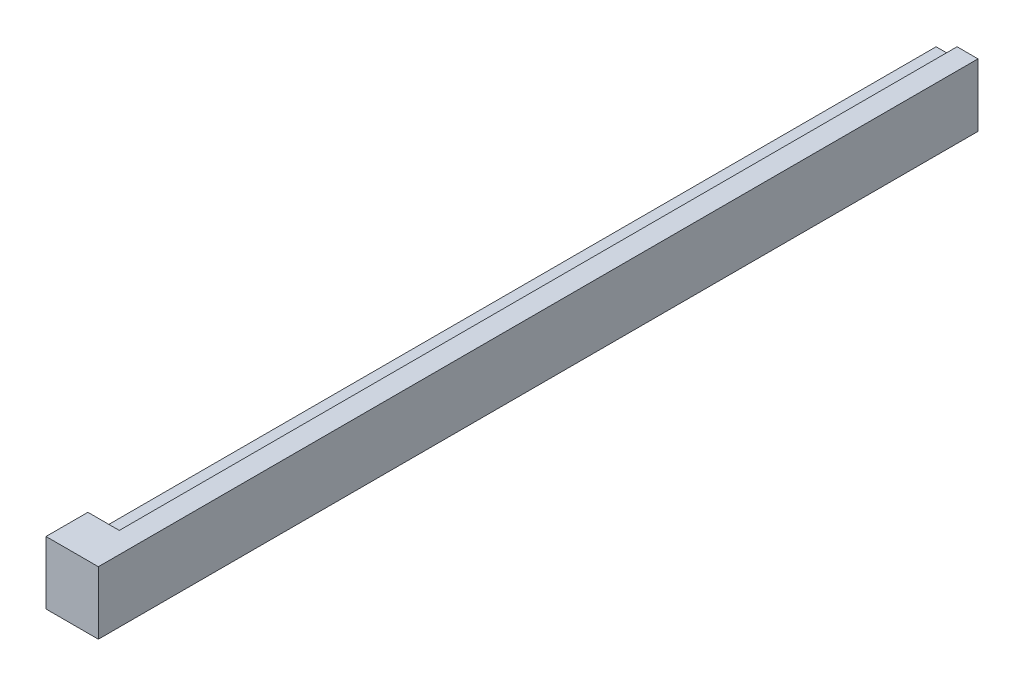
ISO-10303-21;
HEADER;
FILE_DESCRIPTION(('STEP AP214'),'2;1');
FILE_NAME('part.step','',(''),(''),'','','');
FILE_SCHEMA(('AUTOMOTIVE_DESIGN { 1 0 10303 214 1 1 1 1 }'));
ENDSEC;
DATA;
#1=APPLICATION_CONTEXT('core data for automotive mechanical design processes');
#2=APPLICATION_PROTOCOL_DEFINITION('international standard','automotive_design',2000,#1);
#3=PRODUCT_CONTEXT('',#1,'mechanical');
#4=PRODUCT('Part','Part','',(#3));
#5=PRODUCT_RELATED_PRODUCT_CATEGORY('part','',(#4));
#6=PRODUCT_DEFINITION_FORMATION('','',#4);
#7=PRODUCT_DEFINITION_CONTEXT('part definition',#1,'design');
#8=PRODUCT_DEFINITION('design','',#6,#7);
#9=PRODUCT_DEFINITION_SHAPE('','',#8);
#10=(LENGTH_UNIT() NAMED_UNIT(*) SI_UNIT(.MILLI.,.METRE.));
#11=(NAMED_UNIT(*) PLANE_ANGLE_UNIT() SI_UNIT($,.RADIAN.));
#12=(NAMED_UNIT(*) SI_UNIT($,.STERADIAN.) SOLID_ANGLE_UNIT());
#13=UNCERTAINTY_MEASURE_WITH_UNIT(LENGTH_MEASURE(1.E-05),#10,'distance_accuracy_value','');
#14=(GEOMETRIC_REPRESENTATION_CONTEXT(3) GLOBAL_UNCERTAINTY_ASSIGNED_CONTEXT((#13)) GLOBAL_UNIT_ASSIGNED_CONTEXT((#10,
#11,#12)) REPRESENTATION_CONTEXT('',''));
#15=CARTESIAN_POINT('',(0.,0.,0.));
#16=DIRECTION('',(0.,0.,1.));
#17=DIRECTION('',(1.,0.,0.));
#18=AXIS2_PLACEMENT_3D('',#15,#16,#17);
#19=CARTESIAN_POINT('',(25.,-25.,1000.));
#20=DIRECTION('',(0.,1.,0.));
#21=DIRECTION('',(0.,0.,1.));
#22=AXIS2_PLACEMENT_3D('',#19,#20,#21);
#23=PLANE('',#22);
#24=DIRECTION('',(1.,0.,0.));
#25=VECTOR('',#24,1.);
#26=CARTESIAN_POINT('',(25.,-25.,-1000.));
#27=LINE('',#26,#25);
#28=CARTESIAN_POINT('',(0.,-25.,-1000.));
#29=VERTEX_POINT('',#28);
#30=CARTESIAN_POINT('',(25.,-25.,-1000.));
#31=VERTEX_POINT('',#30);
#32=EDGE_CURVE('E189',#29,#31,#27,.T.);
#33=ORIENTED_EDGE('',*,*,#32,.T.);
#34=DIRECTION('',(0.,0.,-1.));
#35=VECTOR('',#34,1.);
#36=CARTESIAN_POINT('',(25.,-25.,1000.));
#37=LINE('',#36,#35);
#38=CARTESIAN_POINT('',(25.,-25.,1000.));
#39=VERTEX_POINT('',#38);
#40=EDGE_CURVE('E46',#39,#31,#37,.T.);
#41=ORIENTED_EDGE('',*,*,#40,.F.);
#42=DIRECTION('',(1.,0.,0.));
#43=VECTOR('',#42,1.);
#44=CARTESIAN_POINT('',(25.,-25.,1000.));
#45=LINE('',#44,#43);
#46=CARTESIAN_POINT('',(0.,-25.,1000.));
#47=VERTEX_POINT('',#46);
#48=EDGE_CURVE('E120',#47,#39,#45,.T.);
#49=ORIENTED_EDGE('',*,*,#48,.F.);
#50=DIRECTION('',(0.,0.,-1.));
#51=VECTOR('',#50,1.);
#52=CARTESIAN_POINT('',(0.,-25.,1000.));
#53=LINE('',#52,#51);
#54=EDGE_CURVE('E11',#47,#29,#53,.T.);
#55=ORIENTED_EDGE('',*,*,#54,.T.);
#56=EDGE_LOOP('',(#33,#41,#49,#55));
#57=FACE_BOUND('',#56,.T.);
#58=ADVANCED_FACE('F38',(#57),#23,.F.);
#59=CARTESIAN_POINT('',(25.,-50.,1000.));
#60=DIRECTION('',(1.,0.,0.));
#61=DIRECTION('',(0.,0.,-1.));
#62=AXIS2_PLACEMENT_3D('',#59,#60,#61);
#63=PLANE('',#62);
#64=DIRECTION('',(0.,-1.,0.));
#65=VECTOR('',#64,1.);
#66=CARTESIAN_POINT('',(25.,-50.,-1000.));
#67=LINE('',#66,#65);
#68=CARTESIAN_POINT('',(25.,-50.,-1000.));
#69=VERTEX_POINT('',#68);
#70=EDGE_CURVE('E191',#31,#69,#67,.T.);
#71=ORIENTED_EDGE('',*,*,#70,.T.);
#72=DIRECTION('',(0.,0.,-1.));
#73=VECTOR('',#72,1.);
#74=CARTESIAN_POINT('',(25.,-50.,1000.));
#75=LINE('',#74,#73);
#76=CARTESIAN_POINT('',(25.,-50.,1000.));
#77=VERTEX_POINT('',#76);
#78=EDGE_CURVE('E247',#77,#69,#75,.T.);
#79=ORIENTED_EDGE('',*,*,#78,.F.);
#80=DIRECTION('',(0.,-1.,0.));
#81=VECTOR('',#80,1.);
#82=CARTESIAN_POINT('',(25.,-50.,1000.));
#83=LINE('',#82,#81);
#84=EDGE_CURVE('E255',#39,#77,#83,.T.);
#85=ORIENTED_EDGE('',*,*,#84,.F.);
#86=ORIENTED_EDGE('',*,*,#40,.T.);
#87=EDGE_LOOP('',(#71,#79,#85,#86));
#88=FACE_BOUND('',#87,.T.);
#89=ADVANCED_FACE('F253',(#88),#63,.F.);
#90=CARTESIAN_POINT('',(50.,-50.,1000.));
#91=DIRECTION('',(0.,1.,0.));
#92=DIRECTION('',(0.,0.,1.));
#93=AXIS2_PLACEMENT_3D('',#90,#91,#92);
#94=PLANE('',#93);
#95=DIRECTION('',(1.,0.,0.));
#96=VECTOR('',#95,1.);
#97=CARTESIAN_POINT('',(50.,-50.,-1000.));
#98=LINE('',#97,#96);
#99=CARTESIAN_POINT('',(50.,-50.,-1000.));
#100=VERTEX_POINT('',#99);
#101=EDGE_CURVE('E194',#69,#100,#98,.T.);
#102=ORIENTED_EDGE('',*,*,#101,.T.);
#103=DIRECTION('',(0.,0.,-1.));
#104=VECTOR('',#103,1.);
#105=CARTESIAN_POINT('',(50.,-50.,1000.));
#106=LINE('',#105,#104);
#107=CARTESIAN_POINT('',(50.,-50.,1000.));
#108=VERTEX_POINT('',#107);
#109=EDGE_CURVE('E244',#108,#100,#106,.T.);
#110=ORIENTED_EDGE('',*,*,#109,.F.);
#111=DIRECTION('',(1.,0.,0.));
#112=VECTOR('',#111,1.);
#113=CARTESIAN_POINT('',(50.,-50.,1000.));
#114=LINE('',#113,#112);
#115=EDGE_CURVE('E276',#77,#108,#114,.T.);
#116=ORIENTED_EDGE('',*,*,#115,.F.);
#117=ORIENTED_EDGE('',*,*,#78,.T.);
#118=EDGE_LOOP('',(#102,#110,#116,#117));
#119=FACE_BOUND('',#118,.T.);
#120=ADVANCED_FACE('F264',(#119),#94,.F.);
#121=CARTESIAN_POINT('',(50.,-25.,1000.));
#122=DIRECTION('',(-1.,0.,0.));
#123=DIRECTION('',(0.,0.,1.));
#124=AXIS2_PLACEMENT_3D('',#121,#122,#123);
#125=PLANE('',#124);
#126=DIRECTION('',(0.,1.,0.));
#127=VECTOR('',#126,1.);
#128=CARTESIAN_POINT('',(50.,-25.,-1000.));
#129=LINE('',#128,#127);
#130=CARTESIAN_POINT('',(50.,-25.,-1000.));
#131=VERTEX_POINT('',#130);
#132=EDGE_CURVE('E196',#100,#131,#129,.T.);
#133=ORIENTED_EDGE('',*,*,#132,.T.);
#134=DIRECTION('',(0.,0.,-1.));
#135=VECTOR('',#134,1.);
#136=CARTESIAN_POINT('',(50.,-25.,1000.));
#137=LINE('',#136,#135);
#138=CARTESIAN_POINT('',(50.,-25.,1000.));
#139=VERTEX_POINT('',#138);
#140=EDGE_CURVE('E241',#139,#131,#137,.T.);
#141=ORIENTED_EDGE('',*,*,#140,.F.);
#142=DIRECTION('',(0.,1.,0.));
#143=VECTOR('',#142,1.);
#144=CARTESIAN_POINT('',(50.,-25.,1000.));
#145=LINE('',#144,#143);
#146=EDGE_CURVE('E270',#108,#139,#145,.T.);
#147=ORIENTED_EDGE('',*,*,#146,.F.);
#148=ORIENTED_EDGE('',*,*,#109,.T.);
#149=EDGE_LOOP('',(#133,#141,#147,#148));
#150=FACE_BOUND('',#149,.T.);
#151=ADVANCED_FACE('F268',(#150),#125,.F.);
#152=CARTESIAN_POINT('',(75.,-25.,1000.));
#153=DIRECTION('',(0.,1.,0.));
#154=DIRECTION('',(-1.,0.,0.));
#155=AXIS2_PLACEMENT_3D('',#152,#153,#154);
#156=PLANE('',#155);
#157=DIRECTION('',(1.,0.,0.));
#158=VECTOR('',#157,1.);
#159=CARTESIAN_POINT('',(75.,-25.,-1000.));
#160=LINE('',#159,#158);
#161=CARTESIAN_POINT('',(75.,-25.,-1000.));
#162=VERTEX_POINT('',#161);
#163=EDGE_CURVE('E198',#131,#162,#160,.T.);
#164=ORIENTED_EDGE('',*,*,#163,.T.);
#165=DIRECTION('',(0.,0.,-1.));
#166=VECTOR('',#165,1.);
#167=CARTESIAN_POINT('',(75.,-25.,1000.));
#168=LINE('',#167,#166);
#169=CARTESIAN_POINT('',(75.,-25.,1000.));
#170=VERTEX_POINT('',#169);
#171=EDGE_CURVE('E238',#170,#162,#168,.T.);
#172=ORIENTED_EDGE('',*,*,#171,.F.);
#173=DIRECTION('',(1.,0.,0.));
#174=VECTOR('',#173,1.);
#175=CARTESIAN_POINT('',(75.,-25.,1000.));
#176=LINE('',#175,#174);
#177=EDGE_CURVE('E275',#139,#170,#176,.T.);
#178=ORIENTED_EDGE('',*,*,#177,.F.);
#179=ORIENTED_EDGE('',*,*,#140,.T.);
#180=EDGE_LOOP('',(#164,#172,#178,#179));
#181=FACE_BOUND('',#180,.T.);
#182=ADVANCED_FACE('F392',(#181),#156,.F.);
#183=CARTESIAN_POINT('',(75.,-75.,1000.));
#184=DIRECTION('',(1.,0.,0.));
#185=DIRECTION('',(0.,1.,0.));
#186=AXIS2_PLACEMENT_3D('',#183,#184,#185);
#187=PLANE('',#186);
#188=DIRECTION('',(0.,-1.,0.));
#189=VECTOR('',#188,1.);
#190=CARTESIAN_POINT('',(75.,-75.,-1000.));
#191=LINE('',#190,#189);
#192=CARTESIAN_POINT('',(75.,-75.,-1000.));
#193=VERTEX_POINT('',#192);
#194=EDGE_CURVE('E200',#162,#193,#191,.T.);
#195=ORIENTED_EDGE('',*,*,#194,.T.);
#196=DIRECTION('',(0.,0.,-1.));
#197=VECTOR('',#196,1.);
#198=CARTESIAN_POINT('',(75.,-75.,1000.));
#199=LINE('',#198,#197);
#200=CARTESIAN_POINT('',(75.,-75.,1000.));
#201=VERTEX_POINT('',#200);
#202=EDGE_CURVE('E235',#201,#193,#199,.T.);
#203=ORIENTED_EDGE('',*,*,#202,.F.);
#204=DIRECTION('',(0.,-1.,0.));
#205=VECTOR('',#204,1.);
#206=CARTESIAN_POINT('',(75.,-75.,1000.));
#207=LINE('',#206,#205);
#208=EDGE_CURVE('E285',#170,#201,#207,.T.);
#209=ORIENTED_EDGE('',*,*,#208,.F.);
#210=ORIENTED_EDGE('',*,*,#171,.T.);
#211=EDGE_LOOP('',(#195,#203,#209,#210));
#212=FACE_BOUND('',#211,.T.);
#213=ADVANCED_FACE('F395',(#212),#187,.F.);
#214=CARTESIAN_POINT('',(125.,-75.,1000.));
#215=DIRECTION('',(0.,1.,0.));
#216=DIRECTION('',(0.,0.,1.));
#217=AXIS2_PLACEMENT_3D('',#214,#215,#216);
#218=PLANE('',#217);
#219=DIRECTION('',(1.,0.,0.));
#220=VECTOR('',#219,1.);
#221=CARTESIAN_POINT('',(125.,-75.,-1000.));
#222=LINE('',#221,#220);
#223=CARTESIAN_POINT('',(125.,-75.,-1000.));
#224=VERTEX_POINT('',#223);
#225=EDGE_CURVE('E202',#193,#224,#222,.T.);
#226=ORIENTED_EDGE('',*,*,#225,.T.);
#227=DIRECTION('',(0.,0.,-1.));
#228=VECTOR('',#227,1.);
#229=CARTESIAN_POINT('',(125.,-75.,1000.));
#230=LINE('',#229,#228);
#231=CARTESIAN_POINT('',(125.,-75.,1100.));
#232=VERTEX_POINT('',#231);
#233=EDGE_CURVE('E232',#232,#224,#230,.T.);
#234=ORIENTED_EDGE('',*,*,#233,.F.);
#235=DIRECTION('',(1.,0.,0.));
#236=VECTOR('',#235,1.);
#237=CARTESIAN_POINT('',(0.,-75.,1100.));
#238=LINE('',#237,#236);
#239=CARTESIAN_POINT('',(0.,-75.,1100.));
#240=VERTEX_POINT('',#239);
#241=EDGE_CURVE('E320',#240,#232,#238,.T.);
#242=ORIENTED_EDGE('',*,*,#241,.F.);
#243=DIRECTION('',(0.,0.,-1.));
#244=VECTOR('',#243,1.);
#245=CARTESIAN_POINT('',(0.,-75.,1100.));
#246=LINE('',#245,#244);
#247=CARTESIAN_POINT('',(0.,-75.,1000.));
#248=VERTEX_POINT('',#247);
#249=EDGE_CURVE('E317',#240,#248,#246,.T.);
#250=ORIENTED_EDGE('',*,*,#249,.T.);
#251=DIRECTION('',(1.,0.,0.));
#252=VECTOR('',#251,1.);
#253=CARTESIAN_POINT('',(0.,-75.,1000.));
#254=LINE('',#253,#252);
#255=EDGE_CURVE('E307',#248,#201,#254,.T.);
#256=ORIENTED_EDGE('',*,*,#255,.T.);
#257=ORIENTED_EDGE('',*,*,#202,.T.);
#258=EDGE_LOOP('',(#226,#234,#242,#250,#256,#257));
#259=FACE_BOUND('',#258,.T.);
#260=ADVANCED_FACE('F328',(#259),#218,.F.);
#261=CARTESIAN_POINT('',(125.,75.,1000.));
#262=DIRECTION('',(-1.,0.,0.));
#263=DIRECTION('',(0.,0.,1.));
#264=AXIS2_PLACEMENT_3D('',#261,#262,#263);
#265=PLANE('',#264);
#266=DIRECTION('',(0.,1.,0.));
#267=VECTOR('',#266,1.);
#268=CARTESIAN_POINT('',(125.,75.,-1000.));
#269=LINE('',#268,#267);
#270=CARTESIAN_POINT('',(125.,75.,-1000.));
#271=VERTEX_POINT('',#270);
#272=EDGE_CURVE('E204',#224,#271,#269,.T.);
#273=ORIENTED_EDGE('',*,*,#272,.T.);
#274=DIRECTION('',(0.,0.,-1.));
#275=VECTOR('',#274,1.);
#276=CARTESIAN_POINT('',(125.,75.,1000.));
#277=LINE('',#276,#275);
#278=CARTESIAN_POINT('',(125.,75.,1100.));
#279=VERTEX_POINT('',#278);
#280=EDGE_CURVE('E229',#279,#271,#277,.T.);
#281=ORIENTED_EDGE('',*,*,#280,.F.);
#282=DIRECTION('',(0.,1.,0.));
#283=VECTOR('',#282,1.);
#284=CARTESIAN_POINT('',(125.,75.,1100.));
#285=LINE('',#284,#283);
#286=EDGE_CURVE('E311',#232,#279,#285,.T.);
#287=ORIENTED_EDGE('',*,*,#286,.F.);
#288=ORIENTED_EDGE('',*,*,#233,.T.);
#289=EDGE_LOOP('',(#273,#281,#287,#288));
#290=FACE_BOUND('',#289,.T.);
#291=ADVANCED_FACE('F366',(#290),#265,.F.);
#292=CARTESIAN_POINT('',(75.,75.,1000.));
#293=DIRECTION('',(0.,-1.,0.));
#294=DIRECTION('',(0.,0.,-1.));
#295=AXIS2_PLACEMENT_3D('',#292,#293,#294);
#296=PLANE('',#295);
#297=DIRECTION('',(-1.,0.,0.));
#298=VECTOR('',#297,1.);
#299=CARTESIAN_POINT('',(75.,75.,-1000.));
#300=LINE('',#299,#298);
#301=CARTESIAN_POINT('',(75.,75.,-1000.));
#302=VERTEX_POINT('',#301);
#303=EDGE_CURVE('E206',#271,#302,#300,.T.);
#304=ORIENTED_EDGE('',*,*,#303,.T.);
#305=DIRECTION('',(0.,0.,-1.));
#306=VECTOR('',#305,1.);
#307=CARTESIAN_POINT('',(75.,75.,1000.));
#308=LINE('',#307,#306);
#309=CARTESIAN_POINT('',(75.,75.,1000.));
#310=VERTEX_POINT('',#309);
#311=EDGE_CURVE('E226',#310,#302,#308,.T.);
#312=ORIENTED_EDGE('',*,*,#311,.F.);
#313=DIRECTION('',(-1.,0.,0.));
#314=VECTOR('',#313,1.);
#315=CARTESIAN_POINT('',(0.,75.,1000.));
#316=LINE('',#315,#314);
#317=CARTESIAN_POINT('',(0.,75.,1000.));
#318=VERTEX_POINT('',#317);
#319=EDGE_CURVE('E290',#310,#318,#316,.T.);
#320=ORIENTED_EDGE('',*,*,#319,.T.);
#321=DIRECTION('',(0.,0.,-1.));
#322=VECTOR('',#321,1.);
#323=CARTESIAN_POINT('',(0.,75.,1100.));
#324=LINE('',#323,#322);
#325=CARTESIAN_POINT('',(0.,75.,1100.));
#326=VERTEX_POINT('',#325);
#327=EDGE_CURVE('E192',#326,#318,#324,.T.);
#328=ORIENTED_EDGE('',*,*,#327,.F.);
#329=DIRECTION('',(-1.,0.,0.));
#330=VECTOR('',#329,1.);
#331=CARTESIAN_POINT('',(0.,75.,1100.));
#332=LINE('',#331,#330);
#333=EDGE_CURVE('E338',#279,#326,#332,.T.);
#334=ORIENTED_EDGE('',*,*,#333,.F.);
#335=ORIENTED_EDGE('',*,*,#280,.T.);
#336=EDGE_LOOP('',(#304,#312,#320,#328,#334,#335));
#337=FACE_BOUND('',#336,.T.);
#338=ADVANCED_FACE('F358',(#337),#296,.F.);
#339=CARTESIAN_POINT('',(75.,25.,1000.));
#340=DIRECTION('',(1.,0.,0.));
#341=DIRECTION('',(0.,0.,-1.));
#342=AXIS2_PLACEMENT_3D('',#339,#340,#341);
#343=PLANE('',#342);
#344=DIRECTION('',(0.,-1.,0.));
#345=VECTOR('',#344,1.);
#346=CARTESIAN_POINT('',(75.,25.,-1000.));
#347=LINE('',#346,#345);
#348=CARTESIAN_POINT('',(75.,25.,-1000.));
#349=VERTEX_POINT('',#348);
#350=EDGE_CURVE('E208',#302,#349,#347,.T.);
#351=ORIENTED_EDGE('',*,*,#350,.T.);
#352=DIRECTION('',(0.,0.,-1.));
#353=VECTOR('',#352,1.);
#354=CARTESIAN_POINT('',(75.,25.,1000.));
#355=LINE('',#354,#353);
#356=CARTESIAN_POINT('',(75.,25.,1000.));
#357=VERTEX_POINT('',#356);
#358=EDGE_CURVE('E223',#357,#349,#355,.T.);
#359=ORIENTED_EDGE('',*,*,#358,.F.);
#360=DIRECTION('',(0.,-1.,0.));
#361=VECTOR('',#360,1.);
#362=CARTESIAN_POINT('',(75.,25.,1000.));
#363=LINE('',#362,#361);
#364=EDGE_CURVE('E180',#310,#357,#363,.T.);
#365=ORIENTED_EDGE('',*,*,#364,.F.);
#366=ORIENTED_EDGE('',*,*,#311,.T.);
#367=EDGE_LOOP('',(#351,#359,#365,#366));
#368=FACE_BOUND('',#367,.T.);
#369=ADVANCED_FACE('F292',(#368),#343,.F.);
#370=CARTESIAN_POINT('',(50.,25.,1000.));
#371=DIRECTION('',(0.,-1.,0.));
#372=DIRECTION('',(1.,0.,0.));
#373=AXIS2_PLACEMENT_3D('',#370,#371,#372);
#374=PLANE('',#373);
#375=DIRECTION('',(-1.,0.,0.));
#376=VECTOR('',#375,1.);
#377=CARTESIAN_POINT('',(50.,25.,-1000.));
#378=LINE('',#377,#376);
#379=CARTESIAN_POINT('',(50.,25.,-1000.));
#380=VERTEX_POINT('',#379);
#381=EDGE_CURVE('E210',#349,#380,#378,.T.);
#382=ORIENTED_EDGE('',*,*,#381,.T.);
#383=DIRECTION('',(0.,0.,-1.));
#384=VECTOR('',#383,1.);
#385=CARTESIAN_POINT('',(50.,25.,1000.));
#386=LINE('',#385,#384);
#387=CARTESIAN_POINT('',(50.,25.,1000.));
#388=VERTEX_POINT('',#387);
#389=EDGE_CURVE('E164',#388,#380,#386,.T.);
#390=ORIENTED_EDGE('',*,*,#389,.F.);
#391=DIRECTION('',(-1.,0.,0.));
#392=VECTOR('',#391,1.);
#393=CARTESIAN_POINT('',(50.,25.,1000.));
#394=LINE('',#393,#392);
#395=EDGE_CURVE('E178',#357,#388,#394,.T.);
#396=ORIENTED_EDGE('',*,*,#395,.F.);
#397=ORIENTED_EDGE('',*,*,#358,.T.);
#398=EDGE_LOOP('',(#382,#390,#396,#397));
#399=FACE_BOUND('',#398,.T.);
#400=ADVANCED_FACE('F296',(#399),#374,.F.);
#401=CARTESIAN_POINT('',(50.,50.,1000.));
#402=DIRECTION('',(-1.,0.,0.));
#403=DIRECTION('',(0.,-1.,0.));
#404=AXIS2_PLACEMENT_3D('',#401,#402,#403);
#405=PLANE('',#404);
#406=DIRECTION('',(0.,1.,0.));
#407=VECTOR('',#406,1.);
#408=CARTESIAN_POINT('',(50.,50.,-1000.));
#409=LINE('',#408,#407);
#410=CARTESIAN_POINT('',(50.,50.,-1000.));
#411=VERTEX_POINT('',#410);
#412=EDGE_CURVE('E161',#380,#411,#409,.T.);
#413=ORIENTED_EDGE('',*,*,#412,.T.);
#414=DIRECTION('',(0.,0.,-1.));
#415=VECTOR('',#414,1.);
#416=CARTESIAN_POINT('',(50.,50.,1000.));
#417=LINE('',#416,#415);
#418=CARTESIAN_POINT('',(50.,50.,1000.));
#419=VERTEX_POINT('',#418);
#420=EDGE_CURVE('E153',#419,#411,#417,.T.);
#421=ORIENTED_EDGE('',*,*,#420,.F.);
#422=DIRECTION('',(0.,1.,0.));
#423=VECTOR('',#422,1.);
#424=CARTESIAN_POINT('',(50.,50.,1000.));
#425=LINE('',#424,#423);
#426=EDGE_CURVE('E158',#388,#419,#425,.T.);
#427=ORIENTED_EDGE('',*,*,#426,.F.);
#428=ORIENTED_EDGE('',*,*,#389,.T.);
#429=EDGE_LOOP('',(#413,#421,#427,#428));
#430=FACE_BOUND('',#429,.T.);
#431=ADVANCED_FACE('F155',(#430),#405,.F.);
#432=CARTESIAN_POINT('',(25.,50.,1000.));
#433=DIRECTION('',(0.,-1.,0.));
#434=DIRECTION('',(0.,0.,-1.));
#435=AXIS2_PLACEMENT_3D('',#432,#433,#434);
#436=PLANE('',#435);
#437=DIRECTION('',(-1.,0.,0.));
#438=VECTOR('',#437,1.);
#439=CARTESIAN_POINT('',(25.,50.,-1000.));
#440=LINE('',#439,#438);
#441=CARTESIAN_POINT('',(25.,50.,-1000.));
#442=VERTEX_POINT('',#441);
#443=EDGE_CURVE('E213',#411,#442,#440,.T.);
#444=ORIENTED_EDGE('',*,*,#443,.T.);
#445=DIRECTION('',(0.,0.,-1.));
#446=VECTOR('',#445,1.);
#447=CARTESIAN_POINT('',(25.,50.,1000.));
#448=LINE('',#447,#446);
#449=CARTESIAN_POINT('',(25.,50.,1000.));
#450=VERTEX_POINT('',#449);
#451=EDGE_CURVE('E165',#450,#442,#448,.T.);
#452=ORIENTED_EDGE('',*,*,#451,.F.);
#453=DIRECTION('',(-1.,0.,0.));
#454=VECTOR('',#453,1.);
#455=CARTESIAN_POINT('',(25.,50.,1000.));
#456=LINE('',#455,#454);
#457=EDGE_CURVE('E168',#419,#450,#456,.T.);
#458=ORIENTED_EDGE('',*,*,#457,.F.);
#459=ORIENTED_EDGE('',*,*,#420,.T.);
#460=EDGE_LOOP('',(#444,#452,#458,#459));
#461=FACE_BOUND('',#460,.T.);
#462=ADVANCED_FACE('F169',(#461),#436,.F.);
#463=CARTESIAN_POINT('',(25.,25.,1000.));
#464=DIRECTION('',(1.,0.,0.));
#465=DIRECTION('',(0.,0.,-1.));
#466=AXIS2_PLACEMENT_3D('',#463,#464,#465);
#467=PLANE('',#466);
#468=DIRECTION('',(0.,-1.,0.));
#469=VECTOR('',#468,1.);
#470=CARTESIAN_POINT('',(25.,25.,-1000.));
#471=LINE('',#470,#469);
#472=CARTESIAN_POINT('',(25.,25.,-1000.));
#473=VERTEX_POINT('',#472);
#474=EDGE_CURVE('E106',#442,#473,#471,.T.);
#475=ORIENTED_EDGE('',*,*,#474,.T.);
#476=DIRECTION('',(0.,0.,-1.));
#477=VECTOR('',#476,1.);
#478=CARTESIAN_POINT('',(25.,25.,1000.));
#479=LINE('',#478,#477);
#480=CARTESIAN_POINT('',(25.,25.,1000.));
#481=VERTEX_POINT('',#480);
#482=EDGE_CURVE('E54',#481,#473,#479,.T.);
#483=ORIENTED_EDGE('',*,*,#482,.F.);
#484=DIRECTION('',(0.,-1.,0.));
#485=VECTOR('',#484,1.);
#486=CARTESIAN_POINT('',(25.,25.,1000.));
#487=LINE('',#486,#485);
#488=EDGE_CURVE('E172',#450,#481,#487,.T.);
#489=ORIENTED_EDGE('',*,*,#488,.F.);
#490=ORIENTED_EDGE('',*,*,#451,.T.);
#491=EDGE_LOOP('',(#475,#483,#489,#490));
#492=FACE_BOUND('',#491,.T.);
#493=ADVANCED_FACE('F297',(#492),#467,.F.);
#494=CARTESIAN_POINT('',(0.,25.,1000.));
#495=DIRECTION('',(0.,-1.,0.));
#496=DIRECTION('',(0.,0.,-1.));
#497=AXIS2_PLACEMENT_3D('',#494,#495,#496);
#498=PLANE('',#497);
#499=DIRECTION('',(-1.,0.,0.));
#500=VECTOR('',#499,1.);
#501=CARTESIAN_POINT('',(0.,25.,-1000.));
#502=LINE('',#501,#500);
#503=CARTESIAN_POINT('',(0.,25.,-1000.));
#504=VERTEX_POINT('',#503);
#505=EDGE_CURVE('E112',#473,#504,#502,.T.);
#506=ORIENTED_EDGE('',*,*,#505,.T.);
#507=DIRECTION('',(0.,0.,-1.));
#508=VECTOR('',#507,1.);
#509=CARTESIAN_POINT('',(0.,25.,1000.));
#510=LINE('',#509,#508);
#511=CARTESIAN_POINT('',(0.,25.,1000.));
#512=VERTEX_POINT('',#511);
#513=EDGE_CURVE('E188',#512,#504,#510,.T.);
#514=ORIENTED_EDGE('',*,*,#513,.F.);
#515=DIRECTION('',(-1.,0.,0.));
#516=VECTOR('',#515,1.);
#517=CARTESIAN_POINT('',(0.,25.,1000.));
#518=LINE('',#517,#516);
#519=EDGE_CURVE('E185',#481,#512,#518,.T.);
#520=ORIENTED_EDGE('',*,*,#519,.F.);
#521=ORIENTED_EDGE('',*,*,#482,.T.);
#522=EDGE_LOOP('',(#506,#514,#520,#521));
#523=FACE_BOUND('',#522,.T.);
#524=ADVANCED_FACE('F416',(#523),#498,.F.);
#525=CARTESIAN_POINT('',(0.,0.,1000.));
#526=DIRECTION('',(1.,0.,0.));
#527=DIRECTION('',(0.,0.,-1.));
#528=AXIS2_PLACEMENT_3D('',#525,#526,#527);
#529=PLANE('',#528);
#530=DIRECTION('',(0.,-1.,0.));
#531=VECTOR('',#530,1.);
#532=CARTESIAN_POINT('',(0.,0.,-1000.));
#533=LINE('',#532,#531);
#534=EDGE_CURVE('E217',#504,#29,#533,.T.);
#535=ORIENTED_EDGE('',*,*,#534,.T.);
#536=ORIENTED_EDGE('',*,*,#54,.F.);
#537=DIRECTION('',(0.,-1.,0.));
#538=VECTOR('',#537,1.);
#539=CARTESIAN_POINT('',(0.,75.,1000.));
#540=LINE('',#539,#538);
#541=EDGE_CURVE('E308',#47,#248,#540,.T.);
#542=ORIENTED_EDGE('',*,*,#541,.T.);
#543=ORIENTED_EDGE('',*,*,#249,.F.);
#544=DIRECTION('',(0.,-1.,0.));
#545=VECTOR('',#544,1.);
#546=CARTESIAN_POINT('',(0.,75.,1100.));
#547=LINE('',#546,#545);
#548=EDGE_CURVE('E337',#326,#240,#547,.T.);
#549=ORIENTED_EDGE('',*,*,#548,.F.);
#550=ORIENTED_EDGE('',*,*,#327,.T.);
#551=EDGE_CURVE('E300',#318,#512,#540,.T.);
#552=ORIENTED_EDGE('',*,*,#551,.T.);
#553=ORIENTED_EDGE('',*,*,#513,.T.);
#554=EDGE_LOOP('',(#535,#536,#542,#543,#549,#550,#552,#553));
#555=FACE_BOUND('',#554,.T.);
#556=ADVANCED_FACE('F304',(#555),#529,.F.);
#557=CARTESIAN_POINT('',(0.,0.,-1000.));
#558=DIRECTION('',(0.,0.,-1.));
#559=DIRECTION('',(-1.,0.,0.));
#560=AXIS2_PLACEMENT_3D('',#557,#558,#559);
#561=PLANE('',#560);
#562=CARTESIAN_POINT('',(100.,50.,-1000.));
#563=DIRECTION('',(0.,0.,-1.));
#564=DIRECTION('',(-1.,0.,0.));
#565=AXIS2_PLACEMENT_3D('',#562,#563,#564);
#566=CIRCLE('',#565,9.99999999999999);
#567=CARTESIAN_POINT('',(90.,50.,-1000.));
#568=VERTEX_POINT('',#567);
#569=EDGE_CURVE('E350',#568,#568,#566,.T.);
#570=ORIENTED_EDGE('',*,*,#569,.F.);
#571=EDGE_LOOP('',(#570));
#572=FACE_BOUND('',#571,.T.);
#573=CARTESIAN_POINT('',(100.,-50.,-1000.));
#574=DIRECTION('',(0.,0.,-1.));
#575=DIRECTION('',(1.,0.,0.));
#576=AXIS2_PLACEMENT_3D('',#573,#574,#575);
#577=CIRCLE('',#576,9.99999999999999);
#578=CARTESIAN_POINT('',(110.,-50.,-1000.));
#579=VERTEX_POINT('',#578);
#580=EDGE_CURVE('E344',#579,#579,#577,.T.);
#581=ORIENTED_EDGE('',*,*,#580,.F.);
#582=EDGE_LOOP('',(#581));
#583=FACE_BOUND('',#582,.T.);
#584=ORIENTED_EDGE('',*,*,#32,.F.);
#585=ORIENTED_EDGE('',*,*,#534,.F.);
#586=ORIENTED_EDGE('',*,*,#505,.F.);
#587=ORIENTED_EDGE('',*,*,#474,.F.);
#588=ORIENTED_EDGE('',*,*,#443,.F.);
#589=ORIENTED_EDGE('',*,*,#412,.F.);
#590=ORIENTED_EDGE('',*,*,#381,.F.);
#591=ORIENTED_EDGE('',*,*,#350,.F.);
#592=ORIENTED_EDGE('',*,*,#303,.F.);
#593=ORIENTED_EDGE('',*,*,#272,.F.);
#594=ORIENTED_EDGE('',*,*,#225,.F.);
#595=ORIENTED_EDGE('',*,*,#194,.F.);
#596=ORIENTED_EDGE('',*,*,#163,.F.);
#597=ORIENTED_EDGE('',*,*,#132,.F.);
#598=ORIENTED_EDGE('',*,*,#101,.F.);
#599=ORIENTED_EDGE('',*,*,#70,.F.);
#600=EDGE_LOOP('',(#584,#585,#586,#587,#588,#589,#590,#591,#592,#593,#594,#595,#596,#597,#598,#599));
#601=FACE_BOUND('',#600,.T.);
#602=ADVANCED_FACE('F259',(#572,#583,#601),#561,.T.);
#603=CARTESIAN_POINT('',(0.,0.,1000.));
#604=DIRECTION('',(0.,0.,1.));
#605=DIRECTION('',(1.,0.,0.));
#606=AXIS2_PLACEMENT_3D('',#603,#604,#605);
#607=PLANE('',#606);
#608=ORIENTED_EDGE('',*,*,#541,.F.);
#609=ORIENTED_EDGE('',*,*,#48,.T.);
#610=ORIENTED_EDGE('',*,*,#84,.T.);
#611=ORIENTED_EDGE('',*,*,#115,.T.);
#612=ORIENTED_EDGE('',*,*,#146,.T.);
#613=ORIENTED_EDGE('',*,*,#177,.T.);
#614=ORIENTED_EDGE('',*,*,#208,.T.);
#615=ORIENTED_EDGE('',*,*,#255,.F.);
#616=EDGE_LOOP('',(#608,#609,#610,#611,#612,#613,#614,#615));
#617=FACE_BOUND('',#616,.T.);
#618=ADVANCED_FACE('F279',(#617),#607,.F.);
#619=ORIENTED_EDGE('',*,*,#319,.F.);
#620=ORIENTED_EDGE('',*,*,#364,.T.);
#621=ORIENTED_EDGE('',*,*,#395,.T.);
#622=ORIENTED_EDGE('',*,*,#426,.T.);
#623=ORIENTED_EDGE('',*,*,#457,.T.);
#624=ORIENTED_EDGE('',*,*,#488,.T.);
#625=ORIENTED_EDGE('',*,*,#519,.T.);
#626=ORIENTED_EDGE('',*,*,#551,.F.);
#627=EDGE_LOOP('',(#619,#620,#621,#622,#623,#624,#625,#626));
#628=FACE_BOUND('',#627,.T.);
#629=ADVANCED_FACE('F175',(#628),#607,.F.);
#630=CARTESIAN_POINT('',(0.,0.,1100.));
#631=DIRECTION('',(0.,0.,1.));
#632=DIRECTION('',(1.,0.,0.));
#633=AXIS2_PLACEMENT_3D('',#630,#631,#632);
#634=PLANE('',#633);
#635=ORIENTED_EDGE('',*,*,#286,.T.);
#636=ORIENTED_EDGE('',*,*,#333,.T.);
#637=ORIENTED_EDGE('',*,*,#548,.T.);
#638=ORIENTED_EDGE('',*,*,#241,.T.);
#639=EDGE_LOOP('',(#635,#636,#637,#638));
#640=FACE_BOUND('',#639,.T.);
#641=ADVANCED_FACE('F369',(#640),#634,.T.);
#642=CARTESIAN_POINT('',(100.,-50.,-990.));
#643=DIRECTION('',(0.,0.,-1.));
#644=DIRECTION('',(-1.,0.,0.));
#645=AXIS2_PLACEMENT_3D('',#642,#643,#644);
#646=CYLINDRICAL_SURFACE('',#645,9.99999999999999);
#647=CARTESIAN_POINT('',(100.,-50.,-990.));
#648=DIRECTION('',(0.,0.,-1.));
#649=DIRECTION('',(1.,0.,0.));
#650=AXIS2_PLACEMENT_3D('',#647,#648,#649);
#651=CIRCLE('',#650,9.99999999999999);
#652=CARTESIAN_POINT('',(110.,-50.,-990.));
#653=VERTEX_POINT('',#652);
#654=EDGE_CURVE('E347',#653,#653,#651,.T.);
#655=ORIENTED_EDGE('',*,*,#654,.F.);
#656=EDGE_LOOP('',(#655));
#657=FACE_BOUND('',#656,.T.);
#658=ORIENTED_EDGE('',*,*,#580,.T.);
#659=EDGE_LOOP('',(#658));
#660=FACE_BOUND('',#659,.T.);
#661=ADVANCED_FACE('F371',(#657,#660),#646,.F.);
#662=CARTESIAN_POINT('',(100.,-50.,-990.));
#663=DIRECTION('',(0.,0.,1.));
#664=DIRECTION('',(1.,0.,0.));
#665=AXIS2_PLACEMENT_3D('',#662,#663,#664);
#666=PLANE('',#665);
#667=ORIENTED_EDGE('',*,*,#654,.T.);
#668=EDGE_LOOP('',(#667));
#669=FACE_BOUND('',#668,.T.);
#670=ADVANCED_FACE('F377',(#669),#666,.F.);
#671=CARTESIAN_POINT('',(100.,50.,-990.));
#672=DIRECTION('',(0.,0.,-1.));
#673=DIRECTION('',(-1.,0.,0.));
#674=AXIS2_PLACEMENT_3D('',#671,#672,#673);
#675=CYLINDRICAL_SURFACE('',#674,9.99999999999999);
#676=CARTESIAN_POINT('',(100.,50.,-990.));
#677=DIRECTION('',(0.,0.,-1.));
#678=DIRECTION('',(-1.,0.,0.));
#679=AXIS2_PLACEMENT_3D('',#676,#677,#678);
#680=CIRCLE('',#679,9.99999999999999);
#681=CARTESIAN_POINT('',(90.,50.,-990.));
#682=VERTEX_POINT('',#681);
#683=EDGE_CURVE('E353',#682,#682,#680,.T.);
#684=ORIENTED_EDGE('',*,*,#683,.F.);
#685=EDGE_LOOP('',(#684));
#686=FACE_BOUND('',#685,.T.);
#687=ORIENTED_EDGE('',*,*,#569,.T.);
#688=EDGE_LOOP('',(#687));
#689=FACE_BOUND('',#688,.T.);
#690=ADVANCED_FACE('F458',(#686,#689),#675,.F.);
#691=CARTESIAN_POINT('',(100.,50.,-990.));
#692=DIRECTION('',(0.,0.,-1.));
#693=DIRECTION('',(-1.,0.,0.));
#694=AXIS2_PLACEMENT_3D('',#691,#692,#693);
#695=PLANE('',#694);
#696=ORIENTED_EDGE('',*,*,#683,.T.);
#697=EDGE_LOOP('',(#696));
#698=FACE_BOUND('',#697,.T.);
#699=ADVANCED_FACE('F468',(#698),#695,.T.);
#700=CLOSED_SHELL('',(#58,#89,#120,#151,#182,#213,#260,#291,#338,#369,#400,#431,#462,#493,#524,
#556,#602,#618,#629,#641,#661,#670,#690,#699));
#701=MANIFOLD_SOLID_BREP('B2',#700);
#702=ADVANCED_BREP_SHAPE_REPRESENTATION('',(#18,#701),#14);
#703=SHAPE_DEFINITION_REPRESENTATION(#9,#702);
ENDSEC;
END-ISO-10303-21;
